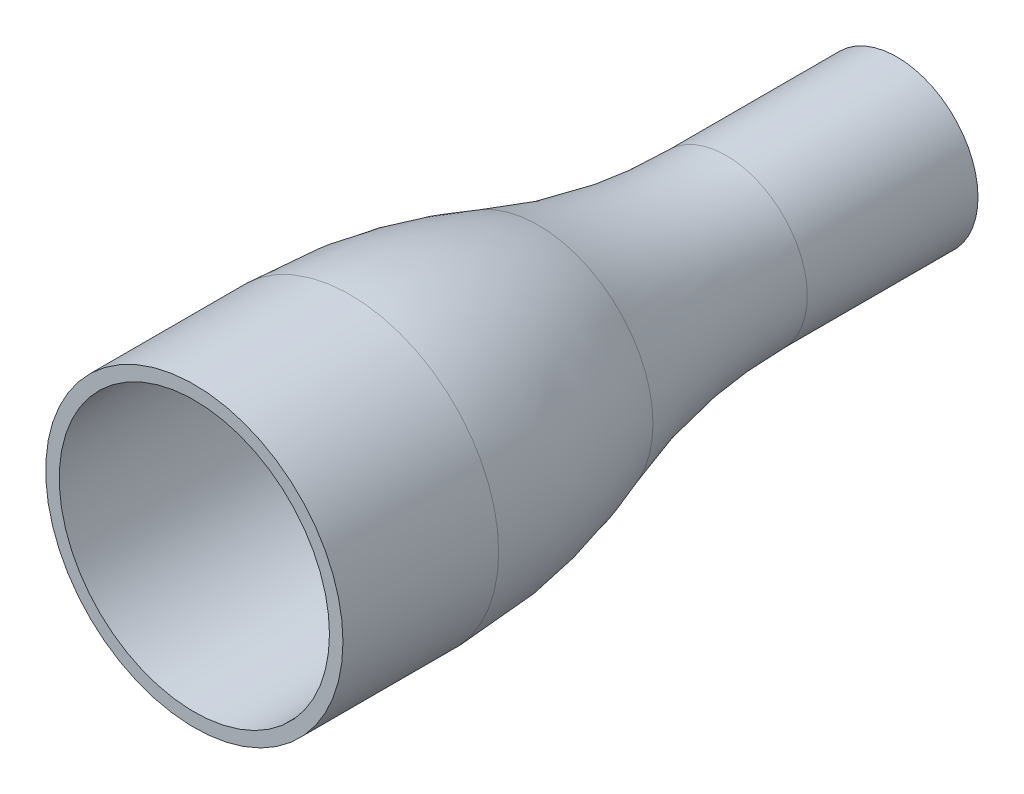
ISO-10303-21;
HEADER;
FILE_DESCRIPTION(('STEP AP214'),'2;1');
FILE_NAME('part.step','',(''),(''),'','','');
FILE_SCHEMA(('AUTOMOTIVE_DESIGN { 1 0 10303 214 1 1 1 1 }'));
ENDSEC;
DATA;
#1=APPLICATION_CONTEXT('core data for automotive mechanical design processes');
#2=APPLICATION_PROTOCOL_DEFINITION('international standard','automotive_design',2000,#1);
#3=PRODUCT_CONTEXT('',#1,'mechanical');
#4=PRODUCT('Part','Part','',(#3));
#5=PRODUCT_RELATED_PRODUCT_CATEGORY('part','',(#4));
#6=PRODUCT_DEFINITION_FORMATION('','',#4);
#7=PRODUCT_DEFINITION_CONTEXT('part definition',#1,'design');
#8=PRODUCT_DEFINITION('design','',#6,#7);
#9=PRODUCT_DEFINITION_SHAPE('','',#8);
#10=(LENGTH_UNIT() NAMED_UNIT(*) SI_UNIT(.MILLI.,.METRE.));
#11=(NAMED_UNIT(*) PLANE_ANGLE_UNIT() SI_UNIT($,.RADIAN.));
#12=(NAMED_UNIT(*) SI_UNIT($,.STERADIAN.) SOLID_ANGLE_UNIT());
#13=UNCERTAINTY_MEASURE_WITH_UNIT(LENGTH_MEASURE(1.E-05),#10,'distance_accuracy_value','');
#14=(GEOMETRIC_REPRESENTATION_CONTEXT(3) GLOBAL_UNCERTAINTY_ASSIGNED_CONTEXT((#13)) GLOBAL_UNIT_ASSIGNED_CONTEXT((#10,
#11,#12)) REPRESENTATION_CONTEXT('',''));
#15=CARTESIAN_POINT('',(0.,0.,0.));
#16=DIRECTION('',(0.,0.,1.));
#17=DIRECTION('',(1.,0.,0.));
#18=AXIS2_PLACEMENT_3D('',#15,#16,#17);
#19=CARTESIAN_POINT('',(0.,0.,-4.));
#20=DIRECTION('',(0.,0.,1.));
#21=DIRECTION('',(1.,0.,0.));
#22=AXIS2_PLACEMENT_3D('',#19,#20,#21);
#23=CYLINDRICAL_SURFACE('',#22,2.75);
#24=CARTESIAN_POINT('',(0.,0.,-2.88152372922174));
#25=DIRECTION('',(0.,0.,1.));
#26=DIRECTION('',(1.,0.,0.));
#27=AXIS2_PLACEMENT_3D('',#24,#25,#26);
#28=CIRCLE('',#27,2.75);
#29=CARTESIAN_POINT('',(2.75000000000001,0.,-2.88152372922174));
#30=VERTEX_POINT('',#29);
#31=EDGE_CURVE('E30',#30,#30,#28,.F.);
#32=ORIENTED_EDGE('',*,*,#31,.F.);
#33=EDGE_LOOP('',(#32));
#34=FACE_BOUND('',#33,.T.);
#35=CARTESIAN_POINT('',(0.,0.,0.));
#36=DIRECTION('',(0.,0.,1.));
#37=DIRECTION('',(1.,0.,0.));
#38=AXIS2_PLACEMENT_3D('',#35,#36,#37);
#39=CIRCLE('',#38,2.75);
#40=CARTESIAN_POINT('',(2.75000000000001,0.,0.));
#41=VERTEX_POINT('',#40);
#42=EDGE_CURVE('E18',#41,#41,#39,.T.);
#43=ORIENTED_EDGE('',*,*,#42,.F.);
#44=EDGE_LOOP('',(#43));
#45=FACE_BOUND('',#44,.T.);
#46=ADVANCED_FACE('F15',(#34,#45),#23,.T.);
#47=CARTESIAN_POINT('',(-7.24999999999999,0.,-2.88152372922174));
#48=DIRECTION('',(0.,1.,0.));
#49=DIRECTION('',(1.,0.,0.));
#50=AXIS2_PLACEMENT_3D('',#47,#48,#49);
#51=CIRCLE('',#50,10.);
#52=TRIMMED_CURVE('',#51,(PARAMETER_VALUE(-0.759761932507315)),
(PARAMETER_VALUE(0.759761932507315)),.T.,.PARAMETER.);
#53=CARTESIAN_POINT('',(0.,0.,-2.88152372922174));
#54=DIRECTION('',(0.,0.,1.));
#55=AXIS1_PLACEMENT('',#53,#54);
#56=SURFACE_OF_REVOLUTION('',#52,#55);
#57=ORIENTED_EDGE('',*,*,#31,.T.);
#58=EDGE_LOOP('',(#57));
#59=FACE_BOUND('',#58,.T.);
#60=CARTESIAN_POINT('',(0.,0.,-6.36137645599051));
#61=DIRECTION('',(0.,0.,1.));
#62=DIRECTION('',(1.,0.,0.));
#63=AXIS2_PLACEMENT_3D('',#60,#61,#62);
#64=CIRCLE('',#63,2.125);
#65=CARTESIAN_POINT('',(2.12500000000001,0.,-6.36137645599051));
#66=VERTEX_POINT('',#65);
#67=EDGE_CURVE('E40',#66,#66,#64,.T.);
#68=ORIENTED_EDGE('',*,*,#67,.T.);
#69=EDGE_LOOP('',(#68));
#70=FACE_BOUND('',#69,.T.);
#71=ADVANCED_FACE('F53',(#59,#70),#56,.F.);
#72=CARTESIAN_POINT('',(0.,0.,0.));
#73=DIRECTION('',(0.,0.,1.));
#74=DIRECTION('',(1.,0.,0.));
#75=AXIS2_PLACEMENT_3D('',#72,#73,#74);
#76=PLANE('',#75);
#77=ORIENTED_EDGE('',*,*,#42,.T.);
#78=EDGE_LOOP('',(#77));
#79=FACE_BOUND('',#78,.T.);
#80=CARTESIAN_POINT('',(0.,0.,0.));
#81=DIRECTION('',(0.,0.,1.));
#82=DIRECTION('',(1.,0.,0.));
#83=AXIS2_PLACEMENT_3D('',#80,#81,#82);
#84=CIRCLE('',#83,2.5);
#85=CARTESIAN_POINT('',(2.50000000000001,0.,0.));
#86=VERTEX_POINT('',#85);
#87=EDGE_CURVE('E38',#86,#86,#84,.F.);
#88=ORIENTED_EDGE('',*,*,#87,.T.);
#89=EDGE_LOOP('',(#88));
#90=FACE_BOUND('',#89,.T.);
#91=ADVANCED_FACE('F56',(#79,#90),#76,.T.);
#92=CARTESIAN_POINT('',(0.,0.,-9.84122918275927));
#93=DIRECTION('',(0.,0.,1.));
#94=DIRECTION('',(1.,0.,0.));
#95=AXIS2_PLACEMENT_3D('',#92,#93,#94);
#96=TOROIDAL_SURFACE('',#95,11.5,10.);
#97=ORIENTED_EDGE('',*,*,#67,.F.);
#98=EDGE_LOOP('',(#97));
#99=FACE_BOUND('',#98,.T.);
#100=CARTESIAN_POINT('',(0.,0.,-9.84122918275927));
#101=DIRECTION('',(0.,0.,1.));
#102=DIRECTION('',(1.,0.,0.));
#103=AXIS2_PLACEMENT_3D('',#100,#101,#102);
#104=CIRCLE('',#103,1.5);
#105=CARTESIAN_POINT('',(1.50000000000001,0.,-9.84122918275927));
#106=VERTEX_POINT('',#105);
#107=EDGE_CURVE('E37',#106,#106,#104,.F.);
#108=ORIENTED_EDGE('',*,*,#107,.F.);
#109=EDGE_LOOP('',(#108));
#110=FACE_BOUND('',#109,.T.);
#111=ADVANCED_FACE('F60',(#99,#110),#96,.F.);
#112=CARTESIAN_POINT('',(0.,0.,-4.));
#113=DIRECTION('',(0.,0.,1.));
#114=DIRECTION('',(1.,0.,0.));
#115=AXIS2_PLACEMENT_3D('',#112,#113,#114);
#116=CYLINDRICAL_SURFACE('',#115,2.5);
#117=CARTESIAN_POINT('',(0.,0.,-4.));
#118=DIRECTION('',(0.,0.,1.));
#119=DIRECTION('',(1.,0.,0.));
#120=AXIS2_PLACEMENT_3D('',#117,#118,#119);
#121=CIRCLE('',#120,2.5);
#122=CARTESIAN_POINT('',(2.50000000000001,0.,-4.));
#123=VERTEX_POINT('',#122);
#124=EDGE_CURVE('E35',#123,#123,#121,.F.);
#125=ORIENTED_EDGE('',*,*,#124,.T.);
#126=EDGE_LOOP('',(#125));
#127=FACE_BOUND('',#126,.T.);
#128=ORIENTED_EDGE('',*,*,#87,.F.);
#129=EDGE_LOOP('',(#128));
#130=FACE_BOUND('',#129,.T.);
#131=ADVANCED_FACE('F64',(#127,#130),#116,.F.);
#132=CARTESIAN_POINT('',(0.,0.,-13.));
#133=DIRECTION('',(0.,0.,1.));
#134=DIRECTION('',(1.,0.,0.));
#135=AXIS2_PLACEMENT_3D('',#132,#133,#134);
#136=CYLINDRICAL_SURFACE('',#135,1.5);
#137=ORIENTED_EDGE('',*,*,#107,.T.);
#138=EDGE_LOOP('',(#137));
#139=FACE_BOUND('',#138,.T.);
#140=CARTESIAN_POINT('',(0.,0.,-13.));
#141=DIRECTION('',(0.,0.,1.));
#142=DIRECTION('',(1.,0.,0.));
#143=AXIS2_PLACEMENT_3D('',#140,#141,#142);
#144=CIRCLE('',#143,1.5);
#145=CARTESIAN_POINT('',(1.50000000000001,0.,-13.));
#146=VERTEX_POINT('',#145);
#147=EDGE_CURVE('E27',#146,#146,#144,.F.);
#148=ORIENTED_EDGE('',*,*,#147,.F.);
#149=EDGE_LOOP('',(#148));
#150=FACE_BOUND('',#149,.T.);
#151=ADVANCED_FACE('F68',(#139,#150),#136,.T.);
#152=CARTESIAN_POINT('',(0.,0.,-4.));
#153=DIRECTION('',(0.,0.,-1.));
#154=DIRECTION('',(-1.,0.,0.));
#155=AXIS2_PLACEMENT_3D('',#152,#153,#154);
#156=PLANE('',#155);
#157=ORIENTED_EDGE('',*,*,#124,.F.);
#158=EDGE_LOOP('',(#157));
#159=FACE_BOUND('',#158,.T.);
#160=CARTESIAN_POINT('',(0.,0.,-4.));
#161=DIRECTION('',(0.,0.,1.));
#162=DIRECTION('',(1.,0.,0.));
#163=AXIS2_PLACEMENT_3D('',#160,#161,#162);
#164=CIRCLE('',#163,1.25000000000001);
#165=CARTESIAN_POINT('',(1.25000000000002,0.,-4.));
#166=VERTEX_POINT('',#165);
#167=EDGE_CURVE('E22',#166,#166,#164,.F.);
#168=ORIENTED_EDGE('',*,*,#167,.T.);
#169=EDGE_LOOP('',(#168));
#170=FACE_BOUND('',#169,.T.);
#171=ADVANCED_FACE('F72',(#159,#170),#156,.F.);
#172=CARTESIAN_POINT('',(0.,0.,-13.));
#173=DIRECTION('',(0.,0.,-1.));
#174=DIRECTION('',(-1.,0.,0.));
#175=AXIS2_PLACEMENT_3D('',#172,#173,#174);
#176=PLANE('',#175);
#177=CARTESIAN_POINT('',(0.,0.,-13.));
#178=DIRECTION('',(0.,0.,1.));
#179=DIRECTION('',(1.,0.,0.));
#180=AXIS2_PLACEMENT_3D('',#177,#178,#179);
#181=CIRCLE('',#180,1.25000000000001);
#182=CARTESIAN_POINT('',(1.25000000000002,0.,-13.));
#183=VERTEX_POINT('',#182);
#184=EDGE_CURVE('E10',#183,#183,#181,.T.);
#185=ORIENTED_EDGE('',*,*,#184,.T.);
#186=EDGE_LOOP('',(#185));
#187=FACE_BOUND('',#186,.T.);
#188=ORIENTED_EDGE('',*,*,#147,.T.);
#189=EDGE_LOOP('',(#188));
#190=FACE_BOUND('',#189,.T.);
#191=ADVANCED_FACE('F76',(#187,#190),#176,.T.);
#192=CARTESIAN_POINT('',(0.,0.,-5.));
#193=DIRECTION('',(0.,0.,1.));
#194=DIRECTION('',(1.,0.,0.));
#195=AXIS2_PLACEMENT_3D('',#192,#193,#194);
#196=CYLINDRICAL_SURFACE('',#195,1.25000000000001);
#197=ORIENTED_EDGE('',*,*,#167,.F.);
#198=EDGE_LOOP('',(#197));
#199=FACE_BOUND('',#198,.T.);
#200=ORIENTED_EDGE('',*,*,#184,.F.);
#201=EDGE_LOOP('',(#200));
#202=FACE_BOUND('',#201,.T.);
#203=ADVANCED_FACE('F80',(#199,#202),#196,.F.);
#204=CLOSED_SHELL('',(#46,#71,#91,#111,#131,#151,#171,#191,#203));
#205=MANIFOLD_SOLID_BREP('B1',#204);
#206=ADVANCED_BREP_SHAPE_REPRESENTATION('',(#18,#205),#14);
#207=SHAPE_DEFINITION_REPRESENTATION(#9,#206);
ENDSEC;
END-ISO-10303-21;
